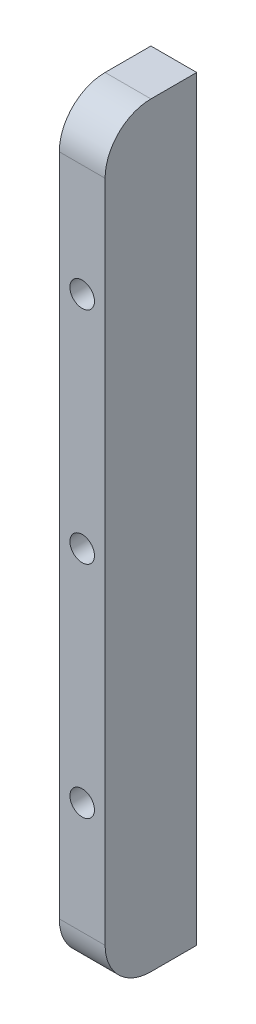
ISO-10303-21;
HEADER;
FILE_DESCRIPTION(('STEP AP214'),'2;1');
FILE_NAME('part.step','',(''),(''),'','','');
FILE_SCHEMA(('AUTOMOTIVE_DESIGN { 1 0 10303 214 1 1 1 1 }'));
ENDSEC;
DATA;
#1=APPLICATION_CONTEXT('core data for automotive mechanical design processes');
#2=APPLICATION_PROTOCOL_DEFINITION('international standard','automotive_design',2000,#1);
#3=PRODUCT_CONTEXT('',#1,'mechanical');
#4=PRODUCT('Part','Part','',(#3));
#5=PRODUCT_RELATED_PRODUCT_CATEGORY('part','',(#4));
#6=PRODUCT_DEFINITION_FORMATION('','',#4);
#7=PRODUCT_DEFINITION_CONTEXT('part definition',#1,'design');
#8=PRODUCT_DEFINITION('design','',#6,#7);
#9=PRODUCT_DEFINITION_SHAPE('','',#8);
#10=(LENGTH_UNIT() NAMED_UNIT(*) SI_UNIT(.MILLI.,.METRE.));
#11=(NAMED_UNIT(*) PLANE_ANGLE_UNIT() SI_UNIT($,.RADIAN.));
#12=(NAMED_UNIT(*) SI_UNIT($,.STERADIAN.) SOLID_ANGLE_UNIT());
#13=UNCERTAINTY_MEASURE_WITH_UNIT(LENGTH_MEASURE(1.E-05),#10,'distance_accuracy_value','');
#14=(GEOMETRIC_REPRESENTATION_CONTEXT(3) GLOBAL_UNCERTAINTY_ASSIGNED_CONTEXT((#13)) GLOBAL_UNIT_ASSIGNED_CONTEXT((#10,
#11,#12)) REPRESENTATION_CONTEXT('',''));
#15=CARTESIAN_POINT('',(0.,0.,0.));
#16=DIRECTION('',(0.,0.,1.));
#17=DIRECTION('',(1.,0.,0.));
#18=AXIS2_PLACEMENT_3D('',#15,#16,#17);
#19=CARTESIAN_POINT('',(6.35,-47.858947368421,43.4473684210526));
#20=DIRECTION('',(0.,1.,0.));
#21=DIRECTION('',(0.,0.,1.));
#22=AXIS2_PLACEMENT_3D('',#19,#20,#21);
#23=PLANE('',#22);
#24=DIRECTION('',(0.,0.,-1.));
#25=VECTOR('',#24,1.);
#26=CARTESIAN_POINT('',(6.35,-47.858947368421,43.4473684210526));
#27=LINE('',#26,#25);
#28=CARTESIAN_POINT('',(6.35,-47.858947368421,37.0973684210526));
#29=VERTEX_POINT('',#28);
#30=CARTESIAN_POINT('',(6.35,-47.858947368421,30.7473684210526));
#31=VERTEX_POINT('',#30);
#32=EDGE_CURVE('E95',#29,#31,#27,.T.);
#33=ORIENTED_EDGE('',*,*,#32,.F.);
#34=DIRECTION('',(-1.,0.,0.));
#35=VECTOR('',#34,1.);
#36=CARTESIAN_POINT('',(6.35,-47.858947368421,37.0973684210526));
#37=LINE('',#36,#35);
#38=CARTESIAN_POINT('',(0.,-47.858947368421,37.0973684210526));
#39=VERTEX_POINT('',#38);
#40=EDGE_CURVE('E118',#29,#39,#37,.T.);
#41=ORIENTED_EDGE('',*,*,#40,.T.);
#42=DIRECTION('',(0.,0.,-1.));
#43=VECTOR('',#42,1.);
#44=CARTESIAN_POINT('',(0.,-47.858947368421,43.4473684210526));
#45=LINE('',#44,#43);
#46=CARTESIAN_POINT('',(0.,-47.858947368421,30.7473684210526));
#47=VERTEX_POINT('',#46);
#48=EDGE_CURVE('E116',#39,#47,#45,.T.);
#49=ORIENTED_EDGE('',*,*,#48,.T.);
#50=DIRECTION('',(-1.,0.,0.));
#51=VECTOR('',#50,1.);
#52=CARTESIAN_POINT('',(6.35,-47.858947368421,30.7473684210526));
#53=LINE('',#52,#51);
#54=EDGE_CURVE('E110',#31,#47,#53,.T.);
#55=ORIENTED_EDGE('',*,*,#54,.F.);
#56=EDGE_LOOP('',(#33,#41,#49,#55));
#57=FACE_BOUND('',#56,.T.);
#58=ADVANCED_FACE('F41',(#57),#23,.F.);
#59=CARTESIAN_POINT('',(6.35,-47.858947368421,30.7473684210526));
#60=DIRECTION('',(0.,0.,1.));
#61=DIRECTION('',(1.,0.,0.));
#62=AXIS2_PLACEMENT_3D('',#59,#60,#61);
#63=PLANE('',#62);
#64=CARTESIAN_POINT('',(3.175,4.52855263157895,30.7473684210526));
#65=DIRECTION('',(0.,0.,-1.));
#66=DIRECTION('',(-1.,0.,0.));
#67=AXIS2_PLACEMENT_3D('',#64,#65,#66);
#68=CIRCLE('',#67,1.7);
#69=CARTESIAN_POINT('',(1.475,4.52855263157895,30.7473684210526));
#70=VERTEX_POINT('',#69);
#71=EDGE_CURVE('E166',#70,#70,#68,.T.);
#72=ORIENTED_EDGE('',*,*,#71,.F.);
#73=EDGE_LOOP('',(#72));
#74=FACE_BOUND('',#73,.T.);
#75=CARTESIAN_POINT('',(3.175,35.0535526315789,30.7473684210526));
#76=DIRECTION('',(0.,0.,-1.));
#77=DIRECTION('',(-1.,0.,0.));
#78=AXIS2_PLACEMENT_3D('',#75,#76,#77);
#79=CIRCLE('',#78,1.7);
#80=CARTESIAN_POINT('',(1.475,35.0535526315789,30.7473684210526));
#81=VERTEX_POINT('',#80);
#82=EDGE_CURVE('E160',#81,#81,#79,.T.);
#83=ORIENTED_EDGE('',*,*,#82,.F.);
#84=EDGE_LOOP('',(#83));
#85=FACE_BOUND('',#84,.T.);
#86=CARTESIAN_POINT('',(3.175,-25.9964473684211,30.7473684210526));
#87=DIRECTION('',(0.,0.,-1.));
#88=DIRECTION('',(-1.,0.,0.));
#89=AXIS2_PLACEMENT_3D('',#86,#87,#88);
#90=CIRCLE('',#89,1.7);
#91=CARTESIAN_POINT('',(1.475,-25.9964473684211,30.7473684210526));
#92=VERTEX_POINT('',#91);
#93=EDGE_CURVE('E154',#92,#92,#90,.T.);
#94=ORIENTED_EDGE('',*,*,#93,.F.);
#95=EDGE_LOOP('',(#94));
#96=FACE_BOUND('',#95,.T.);
#97=DIRECTION('',(0.,1.,0.));
#98=VECTOR('',#97,1.);
#99=CARTESIAN_POINT('',(0.,-47.858947368421,30.7473684210526));
#100=LINE('',#99,#98);
#101=CARTESIAN_POINT('',(0.,56.9160526315789,30.7473684210526));
#102=VERTEX_POINT('',#101);
#103=EDGE_CURVE('E145',#47,#102,#100,.T.);
#104=ORIENTED_EDGE('',*,*,#103,.T.);
#105=DIRECTION('',(-1.,0.,0.));
#106=VECTOR('',#105,1.);
#107=CARTESIAN_POINT('',(6.35,56.9160526315789,30.7473684210526));
#108=LINE('',#107,#106);
#109=CARTESIAN_POINT('',(6.35,56.9160526315789,30.7473684210526));
#110=VERTEX_POINT('',#109);
#111=EDGE_CURVE('E112',#110,#102,#108,.T.);
#112=ORIENTED_EDGE('',*,*,#111,.F.);
#113=DIRECTION('',(0.,1.,0.));
#114=VECTOR('',#113,1.);
#115=CARTESIAN_POINT('',(6.35,-47.858947368421,30.7473684210526));
#116=LINE('',#115,#114);
#117=EDGE_CURVE('E98',#31,#110,#116,.T.);
#118=ORIENTED_EDGE('',*,*,#117,.F.);
#119=ORIENTED_EDGE('',*,*,#54,.T.);
#120=EDGE_LOOP('',(#104,#112,#118,#119));
#121=FACE_BOUND('',#120,.T.);
#122=ADVANCED_FACE('F109',(#74,#85,#96,#121),#63,.F.);
#123=CARTESIAN_POINT('',(6.35,56.9160526315789,30.7473684210526));
#124=DIRECTION('',(0.,-1.,0.));
#125=DIRECTION('',(0.,0.,-1.));
#126=AXIS2_PLACEMENT_3D('',#123,#124,#125);
#127=PLANE('',#126);
#128=DIRECTION('',(0.,0.,1.));
#129=VECTOR('',#128,1.);
#130=CARTESIAN_POINT('',(0.,56.9160526315789,30.7473684210526));
#131=LINE('',#130,#129);
#132=CARTESIAN_POINT('',(0.,56.9160526315789,37.0973684210526));
#133=VERTEX_POINT('',#132);
#134=EDGE_CURVE('E143',#102,#133,#131,.T.);
#135=ORIENTED_EDGE('',*,*,#134,.T.);
#136=DIRECTION('',(-1.,0.,0.));
#137=VECTOR('',#136,1.);
#138=CARTESIAN_POINT('',(6.35,56.9160526315789,37.0973684210526));
#139=LINE('',#138,#137);
#140=CARTESIAN_POINT('',(6.35,56.9160526315789,37.0973684210526));
#141=VERTEX_POINT('',#140);
#142=EDGE_CURVE('E11',#133,#141,#139,.F.);
#143=ORIENTED_EDGE('',*,*,#142,.T.);
#144=DIRECTION('',(0.,0.,1.));
#145=VECTOR('',#144,1.);
#146=CARTESIAN_POINT('',(6.35,56.9160526315789,30.7473684210526));
#147=LINE('',#146,#145);
#148=EDGE_CURVE('E113',#110,#141,#147,.T.);
#149=ORIENTED_EDGE('',*,*,#148,.F.);
#150=ORIENTED_EDGE('',*,*,#111,.T.);
#151=EDGE_LOOP('',(#135,#143,#149,#150));
#152=FACE_BOUND('',#151,.T.);
#153=ADVANCED_FACE('F144',(#152),#127,.F.);
#154=CARTESIAN_POINT('',(6.35,56.9160526315789,43.4473684210526));
#155=DIRECTION('',(0.,0.,-1.));
#156=DIRECTION('',(0.,1.,0.));
#157=AXIS2_PLACEMENT_3D('',#154,#155,#156);
#158=PLANE('',#157);
#159=CARTESIAN_POINT('',(3.175,4.52855263157895,43.4473684210526));
#160=DIRECTION('',(0.,0.,-1.));
#161=DIRECTION('',(-1.,0.,0.));
#162=AXIS2_PLACEMENT_3D('',#159,#160,#161);
#163=CIRCLE('',#162,1.7);
#164=CARTESIAN_POINT('',(1.475,4.52855263157895,43.4473684210526));
#165=VERTEX_POINT('',#164);
#166=EDGE_CURVE('E163',#165,#165,#163,.T.);
#167=ORIENTED_EDGE('',*,*,#166,.T.);
#168=EDGE_LOOP('',(#167));
#169=FACE_BOUND('',#168,.T.);
#170=CARTESIAN_POINT('',(3.175,35.0535526315789,43.4473684210526));
#171=DIRECTION('',(0.,0.,-1.));
#172=DIRECTION('',(-1.,0.,0.));
#173=AXIS2_PLACEMENT_3D('',#170,#171,#172);
#174=CIRCLE('',#173,1.7);
#175=CARTESIAN_POINT('',(1.475,35.0535526315789,43.4473684210526));
#176=VERTEX_POINT('',#175);
#177=EDGE_CURVE('E157',#176,#176,#174,.T.);
#178=ORIENTED_EDGE('',*,*,#177,.T.);
#179=EDGE_LOOP('',(#178));
#180=FACE_BOUND('',#179,.T.);
#181=CARTESIAN_POINT('',(3.175,-25.9964473684211,43.4473684210526));
#182=DIRECTION('',(0.,0.,-1.));
#183=DIRECTION('',(-1.,0.,0.));
#184=AXIS2_PLACEMENT_3D('',#181,#182,#183);
#185=CIRCLE('',#184,1.7);
#186=CARTESIAN_POINT('',(1.475,-25.9964473684211,43.4473684210526));
#187=VERTEX_POINT('',#186);
#188=EDGE_CURVE('E149',#187,#187,#185,.T.);
#189=ORIENTED_EDGE('',*,*,#188,.T.);
#190=EDGE_LOOP('',(#189));
#191=FACE_BOUND('',#190,.T.);
#192=DIRECTION('',(0.,-1.,0.));
#193=VECTOR('',#192,1.);
#194=CARTESIAN_POINT('',(0.,56.9160526315789,43.4473684210526));
#195=LINE('',#194,#193);
#196=CARTESIAN_POINT('',(0.,50.5660526315789,43.4473684210526));
#197=VERTEX_POINT('',#196);
#198=CARTESIAN_POINT('',(0.,-41.508947368421,43.4473684210526));
#199=VERTEX_POINT('',#198);
#200=EDGE_CURVE('E105',#197,#199,#195,.T.);
#201=ORIENTED_EDGE('',*,*,#200,.T.);
#202=DIRECTION('',(-1.,0.,0.));
#203=VECTOR('',#202,1.);
#204=CARTESIAN_POINT('',(6.35,-41.508947368421,43.4473684210526));
#205=LINE('',#204,#203);
#206=CARTESIAN_POINT('',(6.35,-41.508947368421,43.4473684210526));
#207=VERTEX_POINT('',#206);
#208=EDGE_CURVE('E62',#199,#207,#205,.F.);
#209=ORIENTED_EDGE('',*,*,#208,.T.);
#210=DIRECTION('',(0.,-1.,0.));
#211=VECTOR('',#210,1.);
#212=CARTESIAN_POINT('',(6.35,56.9160526315789,43.4473684210526));
#213=LINE('',#212,#211);
#214=CARTESIAN_POINT('',(6.35,50.5660526315789,43.4473684210526));
#215=VERTEX_POINT('',#214);
#216=EDGE_CURVE('E122',#215,#207,#213,.T.);
#217=ORIENTED_EDGE('',*,*,#216,.F.);
#218=DIRECTION('',(-1.,0.,0.));
#219=VECTOR('',#218,1.);
#220=CARTESIAN_POINT('',(6.35,50.5660526315789,43.4473684210526));
#221=LINE('',#220,#219);
#222=EDGE_CURVE('E129',#215,#197,#221,.T.);
#223=ORIENTED_EDGE('',*,*,#222,.T.);
#224=EDGE_LOOP('',(#201,#209,#217,#223));
#225=FACE_BOUND('',#224,.T.);
#226=ADVANCED_FACE('F137',(#169,#180,#191,#225),#158,.F.);
#227=CARTESIAN_POINT('',(6.35,0.,0.));
#228=DIRECTION('',(1.,0.,0.));
#229=DIRECTION('',(0.,0.,-1.));
#230=AXIS2_PLACEMENT_3D('',#227,#228,#229);
#231=PLANE('',#230);
#232=ORIENTED_EDGE('',*,*,#216,.T.);
#233=CARTESIAN_POINT('',(6.35,-41.508947368421,37.0973684210526));
#234=DIRECTION('',(1.,0.,0.));
#235=DIRECTION('',(0.,0.,-1.));
#236=AXIS2_PLACEMENT_3D('',#233,#234,#235);
#237=CIRCLE('',#236,6.35);
#238=EDGE_CURVE('E49',#207,#29,#237,.T.);
#239=ORIENTED_EDGE('',*,*,#238,.T.);
#240=ORIENTED_EDGE('',*,*,#32,.T.);
#241=ORIENTED_EDGE('',*,*,#117,.T.);
#242=ORIENTED_EDGE('',*,*,#148,.T.);
#243=CARTESIAN_POINT('',(6.35,50.5660526315789,37.0973684210526));
#244=DIRECTION('',(1.,0.,0.));
#245=DIRECTION('',(0.,0.,-1.));
#246=AXIS2_PLACEMENT_3D('',#243,#244,#245);
#247=CIRCLE('',#246,6.35);
#248=EDGE_CURVE('E133',#141,#215,#247,.T.);
#249=ORIENTED_EDGE('',*,*,#248,.T.);
#250=EDGE_LOOP('',(#232,#239,#240,#241,#242,#249));
#251=FACE_BOUND('',#250,.T.);
#252=ADVANCED_FACE('F97',(#251),#231,.T.);
#253=CARTESIAN_POINT('',(0.,0.,0.));
#254=DIRECTION('',(1.,0.,0.));
#255=DIRECTION('',(0.,0.,-1.));
#256=AXIS2_PLACEMENT_3D('',#253,#254,#255);
#257=PLANE('',#256);
#258=ORIENTED_EDGE('',*,*,#48,.F.);
#259=CARTESIAN_POINT('',(0.,-41.508947368421,37.0973684210526));
#260=DIRECTION('',(1.,0.,0.));
#261=DIRECTION('',(0.,0.,-1.));
#262=AXIS2_PLACEMENT_3D('',#259,#260,#261);
#263=CIRCLE('',#262,6.35);
#264=EDGE_CURVE('E127',#39,#199,#263,.F.);
#265=ORIENTED_EDGE('',*,*,#264,.T.);
#266=ORIENTED_EDGE('',*,*,#200,.F.);
#267=CARTESIAN_POINT('',(0.,50.5660526315789,37.0973684210526));
#268=DIRECTION('',(1.,0.,0.));
#269=DIRECTION('',(0.,0.,-1.));
#270=AXIS2_PLACEMENT_3D('',#267,#268,#269);
#271=CIRCLE('',#270,6.35);
#272=EDGE_CURVE('E120',#197,#133,#271,.F.);
#273=ORIENTED_EDGE('',*,*,#272,.T.);
#274=ORIENTED_EDGE('',*,*,#134,.F.);
#275=ORIENTED_EDGE('',*,*,#103,.F.);
#276=EDGE_LOOP('',(#258,#265,#266,#273,#274,#275));
#277=FACE_BOUND('',#276,.T.);
#278=ADVANCED_FACE('F142',(#277),#257,.F.);
#279=CARTESIAN_POINT('',(3.175,-25.9964473684211,30.7473684210526));
#280=DIRECTION('',(0.,0.,-1.));
#281=DIRECTION('',(-1.,0.,0.));
#282=AXIS2_PLACEMENT_3D('',#279,#280,#281);
#283=CYLINDRICAL_SURFACE('',#282,1.7);
#284=ORIENTED_EDGE('',*,*,#188,.F.);
#285=EDGE_LOOP('',(#284));
#286=FACE_BOUND('',#285,.T.);
#287=ORIENTED_EDGE('',*,*,#93,.T.);
#288=EDGE_LOOP('',(#287));
#289=FACE_BOUND('',#288,.T.);
#290=ADVANCED_FACE('F179',(#286,#289),#283,.F.);
#291=CARTESIAN_POINT('',(3.175,35.0535526315789,30.7473684210526));
#292=DIRECTION('',(0.,0.,-1.));
#293=DIRECTION('',(-1.,0.,0.));
#294=AXIS2_PLACEMENT_3D('',#291,#292,#293);
#295=CYLINDRICAL_SURFACE('',#294,1.7);
#296=ORIENTED_EDGE('',*,*,#177,.F.);
#297=EDGE_LOOP('',(#296));
#298=FACE_BOUND('',#297,.T.);
#299=ORIENTED_EDGE('',*,*,#82,.T.);
#300=EDGE_LOOP('',(#299));
#301=FACE_BOUND('',#300,.T.);
#302=ADVANCED_FACE('F181',(#298,#301),#295,.F.);
#303=CARTESIAN_POINT('',(3.175,4.52855263157895,30.7473684210526));
#304=DIRECTION('',(0.,0.,-1.));
#305=DIRECTION('',(-1.,0.,0.));
#306=AXIS2_PLACEMENT_3D('',#303,#304,#305);
#307=CYLINDRICAL_SURFACE('',#306,1.7);
#308=ORIENTED_EDGE('',*,*,#166,.F.);
#309=EDGE_LOOP('',(#308));
#310=FACE_BOUND('',#309,.T.);
#311=ORIENTED_EDGE('',*,*,#71,.T.);
#312=EDGE_LOOP('',(#311));
#313=FACE_BOUND('',#312,.T.);
#314=ADVANCED_FACE('F170',(#310,#313),#307,.F.);
#315=CARTESIAN_POINT('',(6.35,-41.508947368421,37.0973684210526));
#316=DIRECTION('',(-1.,0.,0.));
#317=DIRECTION('',(0.,0.,1.));
#318=AXIS2_PLACEMENT_3D('',#315,#316,#317);
#319=CYLINDRICAL_SURFACE('',#318,6.35);
#320=ORIENTED_EDGE('',*,*,#238,.F.);
#321=ORIENTED_EDGE('',*,*,#208,.F.);
#322=ORIENTED_EDGE('',*,*,#264,.F.);
#323=ORIENTED_EDGE('',*,*,#40,.F.);
#324=EDGE_LOOP('',(#320,#321,#322,#323));
#325=FACE_BOUND('',#324,.T.);
#326=ADVANCED_FACE('F200',(#325),#319,.T.);
#327=CARTESIAN_POINT('',(6.35,50.5660526315789,37.0973684210526));
#328=DIRECTION('',(-1.,0.,0.));
#329=DIRECTION('',(0.,0.,1.));
#330=AXIS2_PLACEMENT_3D('',#327,#328,#329);
#331=CYLINDRICAL_SURFACE('',#330,6.35);
#332=ORIENTED_EDGE('',*,*,#248,.F.);
#333=ORIENTED_EDGE('',*,*,#142,.F.);
#334=ORIENTED_EDGE('',*,*,#272,.F.);
#335=ORIENTED_EDGE('',*,*,#222,.F.);
#336=EDGE_LOOP('',(#332,#333,#334,#335));
#337=FACE_BOUND('',#336,.T.);
#338=ADVANCED_FACE('F43',(#337),#331,.T.);
#339=CLOSED_SHELL('',(#58,#122,#153,#226,#252,#278,#290,#302,#314,#326,#338));
#340=MANIFOLD_SOLID_BREP('B2',#339);
#341=ADVANCED_BREP_SHAPE_REPRESENTATION('',(#18,#340),#14);
#342=SHAPE_DEFINITION_REPRESENTATION(#9,#341);
ENDSEC;
END-ISO-10303-21;
